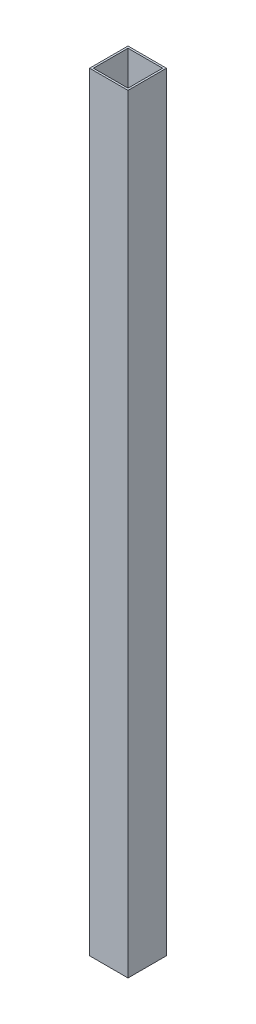
ISO-10303-21;
HEADER;
FILE_DESCRIPTION(('STEP AP214'),'2;1');
FILE_NAME('part.step','',(''),(''),'','','');
FILE_SCHEMA(('AUTOMOTIVE_DESIGN { 1 0 10303 214 1 1 1 1 }'));
ENDSEC;
DATA;
#1=APPLICATION_CONTEXT('core data for automotive mechanical design processes');
#2=APPLICATION_PROTOCOL_DEFINITION('international standard','automotive_design',2000,#1);
#3=PRODUCT_CONTEXT('',#1,'mechanical');
#4=PRODUCT('Part','Part','',(#3));
#5=PRODUCT_RELATED_PRODUCT_CATEGORY('part','',(#4));
#6=PRODUCT_DEFINITION_FORMATION('','',#4);
#7=PRODUCT_DEFINITION_CONTEXT('part definition',#1,'design');
#8=PRODUCT_DEFINITION('design','',#6,#7);
#9=PRODUCT_DEFINITION_SHAPE('','',#8);
#10=(LENGTH_UNIT() NAMED_UNIT(*) SI_UNIT(.MILLI.,.METRE.));
#11=(NAMED_UNIT(*) PLANE_ANGLE_UNIT() SI_UNIT($,.RADIAN.));
#12=(NAMED_UNIT(*) SI_UNIT($,.STERADIAN.) SOLID_ANGLE_UNIT());
#13=UNCERTAINTY_MEASURE_WITH_UNIT(LENGTH_MEASURE(1.E-05),#10,'distance_accuracy_value','');
#14=(GEOMETRIC_REPRESENTATION_CONTEXT(3) GLOBAL_UNCERTAINTY_ASSIGNED_CONTEXT((#13)) GLOBAL_UNIT_ASSIGNED_CONTEXT((#10,
#11,#12)) REPRESENTATION_CONTEXT('',''));
#15=CARTESIAN_POINT('',(0.,0.,0.));
#16=DIRECTION('',(0.,0.,1.));
#17=DIRECTION('',(1.,0.,0.));
#18=AXIS2_PLACEMENT_3D('',#15,#16,#17);
#19=CARTESIAN_POINT('',(0.,400.,0.));
#20=DIRECTION('',(0.,1.,0.));
#21=DIRECTION('',(0.,0.,1.));
#22=AXIS2_PLACEMENT_3D('',#19,#20,#21);
#23=PLANE('',#22);
#24=DIRECTION('',(0.,0.,1.));
#25=VECTOR('',#24,1.);
#26=CARTESIAN_POINT('',(-10.,400.,10.));
#27=LINE('',#26,#25);
#28=CARTESIAN_POINT('',(-10.,400.,-10.));
#29=VERTEX_POINT('',#28);
#30=CARTESIAN_POINT('',(-10.,400.,10.));
#31=VERTEX_POINT('',#30);
#32=EDGE_CURVE('E155',#29,#31,#27,.T.);
#33=ORIENTED_EDGE('',*,*,#32,.T.);
#34=DIRECTION('',(1.,0.,0.));
#35=VECTOR('',#34,1.);
#36=CARTESIAN_POINT('',(10.,400.,10.));
#37=LINE('',#36,#35);
#38=CARTESIAN_POINT('',(10.,400.,10.));
#39=VERTEX_POINT('',#38);
#40=EDGE_CURVE('E159',#31,#39,#37,.T.);
#41=ORIENTED_EDGE('',*,*,#40,.T.);
#42=DIRECTION('',(0.,0.,-1.));
#43=VECTOR('',#42,1.);
#44=CARTESIAN_POINT('',(10.,400.,10.));
#45=LINE('',#44,#43);
#46=CARTESIAN_POINT('',(10.,400.,-10.));
#47=VERTEX_POINT('',#46);
#48=EDGE_CURVE('E163',#39,#47,#45,.T.);
#49=ORIENTED_EDGE('',*,*,#48,.T.);
#50=DIRECTION('',(-1.,0.,0.));
#51=VECTOR('',#50,1.);
#52=CARTESIAN_POINT('',(10.,400.,-10.));
#53=LINE('',#52,#51);
#54=EDGE_CURVE('E166',#47,#29,#53,.T.);
#55=ORIENTED_EDGE('',*,*,#54,.T.);
#56=EDGE_LOOP('',(#33,#41,#49,#55));
#57=FACE_BOUND('',#56,.T.);
#58=DIRECTION('',(-1.,0.,0.));
#59=VECTOR('',#58,1.);
#60=CARTESIAN_POINT('',(9.,400.,-9.));
#61=LINE('',#60,#59);
#62=CARTESIAN_POINT('',(9.,400.,-9.));
#63=VERTEX_POINT('',#62);
#64=CARTESIAN_POINT('',(-9.,400.,-9.));
#65=VERTEX_POINT('',#64);
#66=EDGE_CURVE('E116',#63,#65,#61,.T.);
#67=ORIENTED_EDGE('',*,*,#66,.F.);
#68=DIRECTION('',(0.,0.,-1.));
#69=VECTOR('',#68,1.);
#70=CARTESIAN_POINT('',(9.,400.,9.));
#71=LINE('',#70,#69);
#72=CARTESIAN_POINT('',(9.,400.,9.));
#73=VERTEX_POINT('',#72);
#74=EDGE_CURVE('E107',#73,#63,#71,.T.);
#75=ORIENTED_EDGE('',*,*,#74,.F.);
#76=DIRECTION('',(1.,0.,0.));
#77=VECTOR('',#76,1.);
#78=CARTESIAN_POINT('',(9.,400.,9.));
#79=LINE('',#78,#77);
#80=CARTESIAN_POINT('',(-9.,400.,9.));
#81=VERTEX_POINT('',#80);
#82=EDGE_CURVE('E133',#81,#73,#79,.T.);
#83=ORIENTED_EDGE('',*,*,#82,.F.);
#84=DIRECTION('',(0.,0.,1.));
#85=VECTOR('',#84,1.);
#86=CARTESIAN_POINT('',(-9.,400.,9.));
#87=LINE('',#86,#85);
#88=EDGE_CURVE('E129',#65,#81,#87,.T.);
#89=ORIENTED_EDGE('',*,*,#88,.F.);
#90=EDGE_LOOP('',(#67,#75,#83,#89));
#91=FACE_BOUND('',#90,.T.);
#92=ADVANCED_FACE('F41',(#57,#91),#23,.T.);
#93=CARTESIAN_POINT('',(0.,0.,0.));
#94=DIRECTION('',(0.,1.,0.));
#95=DIRECTION('',(0.,0.,1.));
#96=AXIS2_PLACEMENT_3D('',#93,#94,#95);
#97=PLANE('',#96);
#98=DIRECTION('',(0.,0.,1.));
#99=VECTOR('',#98,1.);
#100=CARTESIAN_POINT('',(-10.,0.,10.));
#101=LINE('',#100,#99);
#102=CARTESIAN_POINT('',(-10.,0.,-10.));
#103=VERTEX_POINT('',#102);
#104=CARTESIAN_POINT('',(-10.,0.,10.));
#105=VERTEX_POINT('',#104);
#106=EDGE_CURVE('E125',#103,#105,#101,.T.);
#107=ORIENTED_EDGE('',*,*,#106,.F.);
#108=DIRECTION('',(-1.,0.,0.));
#109=VECTOR('',#108,1.);
#110=CARTESIAN_POINT('',(10.,0.,-10.));
#111=LINE('',#110,#109);
#112=CARTESIAN_POINT('',(10.,0.,-10.));
#113=VERTEX_POINT('',#112);
#114=EDGE_CURVE('E160',#113,#103,#111,.T.);
#115=ORIENTED_EDGE('',*,*,#114,.F.);
#116=DIRECTION('',(0.,0.,-1.));
#117=VECTOR('',#116,1.);
#118=CARTESIAN_POINT('',(10.,0.,10.));
#119=LINE('',#118,#117);
#120=CARTESIAN_POINT('',(10.,0.,10.));
#121=VERTEX_POINT('',#120);
#122=EDGE_CURVE('E176',#121,#113,#119,.T.);
#123=ORIENTED_EDGE('',*,*,#122,.F.);
#124=DIRECTION('',(1.,0.,0.));
#125=VECTOR('',#124,1.);
#126=CARTESIAN_POINT('',(10.,0.,10.));
#127=LINE('',#126,#125);
#128=EDGE_CURVE('E173',#105,#121,#127,.T.);
#129=ORIENTED_EDGE('',*,*,#128,.F.);
#130=EDGE_LOOP('',(#107,#115,#123,#129));
#131=FACE_BOUND('',#130,.T.);
#132=DIRECTION('',(0.,0.,-1.));
#133=VECTOR('',#132,1.);
#134=CARTESIAN_POINT('',(9.,0.,9.));
#135=LINE('',#134,#133);
#136=CARTESIAN_POINT('',(9.,0.,9.));
#137=VERTEX_POINT('',#136);
#138=CARTESIAN_POINT('',(9.,0.,-9.));
#139=VERTEX_POINT('',#138);
#140=EDGE_CURVE('E65',#137,#139,#135,.T.);
#141=ORIENTED_EDGE('',*,*,#140,.T.);
#142=DIRECTION('',(-1.,0.,0.));
#143=VECTOR('',#142,1.);
#144=CARTESIAN_POINT('',(9.,0.,-9.));
#145=LINE('',#144,#143);
#146=CARTESIAN_POINT('',(-9.,0.,-9.));
#147=VERTEX_POINT('',#146);
#148=EDGE_CURVE('E123',#139,#147,#145,.T.);
#149=ORIENTED_EDGE('',*,*,#148,.T.);
#150=DIRECTION('',(0.,0.,1.));
#151=VECTOR('',#150,1.);
#152=CARTESIAN_POINT('',(-9.,0.,9.));
#153=LINE('',#152,#151);
#154=CARTESIAN_POINT('',(-9.,0.,9.));
#155=VERTEX_POINT('',#154);
#156=EDGE_CURVE('E142',#147,#155,#153,.T.);
#157=ORIENTED_EDGE('',*,*,#156,.T.);
#158=DIRECTION('',(1.,0.,0.));
#159=VECTOR('',#158,1.);
#160=CARTESIAN_POINT('',(9.,0.,9.));
#161=LINE('',#160,#159);
#162=EDGE_CURVE('E117',#155,#137,#161,.T.);
#163=ORIENTED_EDGE('',*,*,#162,.T.);
#164=EDGE_LOOP('',(#141,#149,#157,#163));
#165=FACE_BOUND('',#164,.T.);
#166=ADVANCED_FACE('F199',(#131,#165),#97,.F.);
#167=CARTESIAN_POINT('',(-10.,400.,10.));
#168=DIRECTION('',(1.,0.,0.));
#169=DIRECTION('',(0.,0.,-1.));
#170=AXIS2_PLACEMENT_3D('',#167,#168,#169);
#171=PLANE('',#170);
#172=ORIENTED_EDGE('',*,*,#106,.T.);
#173=DIRECTION('',(0.,-1.,0.));
#174=VECTOR('',#173,1.);
#175=CARTESIAN_POINT('',(-10.,400.,10.));
#176=LINE('',#175,#174);
#177=EDGE_CURVE('E11',#31,#105,#176,.T.);
#178=ORIENTED_EDGE('',*,*,#177,.F.);
#179=ORIENTED_EDGE('',*,*,#32,.F.);
#180=DIRECTION('',(0.,-1.,0.));
#181=VECTOR('',#180,1.);
#182=CARTESIAN_POINT('',(-10.,400.,-10.));
#183=LINE('',#182,#181);
#184=EDGE_CURVE('E169',#29,#103,#183,.T.);
#185=ORIENTED_EDGE('',*,*,#184,.T.);
#186=EDGE_LOOP('',(#172,#178,#179,#185));
#187=FACE_BOUND('',#186,.T.);
#188=ADVANCED_FACE('F43',(#187),#171,.F.);
#189=CARTESIAN_POINT('',(10.,400.,10.));
#190=DIRECTION('',(0.,0.,-1.));
#191=DIRECTION('',(-1.,0.,0.));
#192=AXIS2_PLACEMENT_3D('',#189,#190,#191);
#193=PLANE('',#192);
#194=ORIENTED_EDGE('',*,*,#128,.T.);
#195=DIRECTION('',(0.,-1.,0.));
#196=VECTOR('',#195,1.);
#197=CARTESIAN_POINT('',(10.,400.,10.));
#198=LINE('',#197,#196);
#199=EDGE_CURVE('E50',#39,#121,#198,.T.);
#200=ORIENTED_EDGE('',*,*,#199,.F.);
#201=ORIENTED_EDGE('',*,*,#40,.F.);
#202=ORIENTED_EDGE('',*,*,#177,.T.);
#203=EDGE_LOOP('',(#194,#200,#201,#202));
#204=FACE_BOUND('',#203,.T.);
#205=ADVANCED_FACE('F209',(#204),#193,.F.);
#206=CARTESIAN_POINT('',(10.,400.,10.));
#207=DIRECTION('',(-1.,0.,0.));
#208=DIRECTION('',(0.,0.,1.));
#209=AXIS2_PLACEMENT_3D('',#206,#207,#208);
#210=PLANE('',#209);
#211=ORIENTED_EDGE('',*,*,#122,.T.);
#212=DIRECTION('',(0.,-1.,0.));
#213=VECTOR('',#212,1.);
#214=CARTESIAN_POINT('',(10.,400.,-10.));
#215=LINE('',#214,#213);
#216=EDGE_CURVE('E184',#47,#113,#215,.T.);
#217=ORIENTED_EDGE('',*,*,#216,.F.);
#218=ORIENTED_EDGE('',*,*,#48,.F.);
#219=ORIENTED_EDGE('',*,*,#199,.T.);
#220=EDGE_LOOP('',(#211,#217,#218,#219));
#221=FACE_BOUND('',#220,.T.);
#222=ADVANCED_FACE('F193',(#221),#210,.F.);
#223=CARTESIAN_POINT('',(10.,400.,-10.));
#224=DIRECTION('',(0.,0.,1.));
#225=DIRECTION('',(1.,0.,0.));
#226=AXIS2_PLACEMENT_3D('',#223,#224,#225);
#227=PLANE('',#226);
#228=ORIENTED_EDGE('',*,*,#114,.T.);
#229=ORIENTED_EDGE('',*,*,#184,.F.);
#230=ORIENTED_EDGE('',*,*,#54,.F.);
#231=ORIENTED_EDGE('',*,*,#216,.T.);
#232=EDGE_LOOP('',(#228,#229,#230,#231));
#233=FACE_BOUND('',#232,.T.);
#234=ADVANCED_FACE('F203',(#233),#227,.F.);
#235=CARTESIAN_POINT('',(9.,400.,9.));
#236=DIRECTION('',(-1.,0.,0.));
#237=DIRECTION('',(0.,0.,1.));
#238=AXIS2_PLACEMENT_3D('',#235,#236,#237);
#239=PLANE('',#238);
#240=ORIENTED_EDGE('',*,*,#140,.F.);
#241=DIRECTION('',(0.,-1.,0.));
#242=VECTOR('',#241,1.);
#243=CARTESIAN_POINT('',(9.,400.,9.));
#244=LINE('',#243,#242);
#245=EDGE_CURVE('E111',#73,#137,#244,.T.);
#246=ORIENTED_EDGE('',*,*,#245,.F.);
#247=ORIENTED_EDGE('',*,*,#74,.T.);
#248=DIRECTION('',(0.,-1.,0.));
#249=VECTOR('',#248,1.);
#250=CARTESIAN_POINT('',(9.,400.,-9.));
#251=LINE('',#250,#249);
#252=EDGE_CURVE('E110',#63,#139,#251,.T.);
#253=ORIENTED_EDGE('',*,*,#252,.T.);
#254=EDGE_LOOP('',(#240,#246,#247,#253));
#255=FACE_BOUND('',#254,.T.);
#256=ADVANCED_FACE('F109',(#255),#239,.T.);
#257=CARTESIAN_POINT('',(9.,400.,-9.));
#258=DIRECTION('',(0.,0.,1.));
#259=DIRECTION('',(1.,0.,0.));
#260=AXIS2_PLACEMENT_3D('',#257,#258,#259);
#261=PLANE('',#260);
#262=ORIENTED_EDGE('',*,*,#148,.F.);
#263=ORIENTED_EDGE('',*,*,#252,.F.);
#264=ORIENTED_EDGE('',*,*,#66,.T.);
#265=DIRECTION('',(0.,-1.,0.));
#266=VECTOR('',#265,1.);
#267=CARTESIAN_POINT('',(-9.,400.,-9.));
#268=LINE('',#267,#266);
#269=EDGE_CURVE('E126',#65,#147,#268,.T.);
#270=ORIENTED_EDGE('',*,*,#269,.T.);
#271=EDGE_LOOP('',(#262,#263,#264,#270));
#272=FACE_BOUND('',#271,.T.);
#273=ADVANCED_FACE('F120',(#272),#261,.T.);
#274=CARTESIAN_POINT('',(-9.,400.,9.));
#275=DIRECTION('',(1.,0.,0.));
#276=DIRECTION('',(0.,0.,-1.));
#277=AXIS2_PLACEMENT_3D('',#274,#275,#276);
#278=PLANE('',#277);
#279=ORIENTED_EDGE('',*,*,#156,.F.);
#280=ORIENTED_EDGE('',*,*,#269,.F.);
#281=ORIENTED_EDGE('',*,*,#88,.T.);
#282=DIRECTION('',(0.,-1.,0.));
#283=VECTOR('',#282,1.);
#284=CARTESIAN_POINT('',(-9.,400.,9.));
#285=LINE('',#284,#283);
#286=EDGE_CURVE('E57',#81,#155,#285,.T.);
#287=ORIENTED_EDGE('',*,*,#286,.T.);
#288=EDGE_LOOP('',(#279,#280,#281,#287));
#289=FACE_BOUND('',#288,.T.);
#290=ADVANCED_FACE('F232',(#289),#278,.T.);
#291=CARTESIAN_POINT('',(9.,400.,9.));
#292=DIRECTION('',(0.,0.,-1.));
#293=DIRECTION('',(-1.,0.,0.));
#294=AXIS2_PLACEMENT_3D('',#291,#292,#293);
#295=PLANE('',#294);
#296=ORIENTED_EDGE('',*,*,#162,.F.);
#297=ORIENTED_EDGE('',*,*,#286,.F.);
#298=ORIENTED_EDGE('',*,*,#82,.T.);
#299=ORIENTED_EDGE('',*,*,#245,.T.);
#300=EDGE_LOOP('',(#296,#297,#298,#299));
#301=FACE_BOUND('',#300,.T.);
#302=ADVANCED_FACE('F236',(#301),#295,.T.);
#303=CLOSED_SHELL('',(#92,#166,#188,#205,#222,#234,#256,#273,#290,#302));
#304=MANIFOLD_SOLID_BREP('B2',#303);
#305=ADVANCED_BREP_SHAPE_REPRESENTATION('',(#18,#304),#14);
#306=SHAPE_DEFINITION_REPRESENTATION(#9,#305);
ENDSEC;
END-ISO-10303-21;
